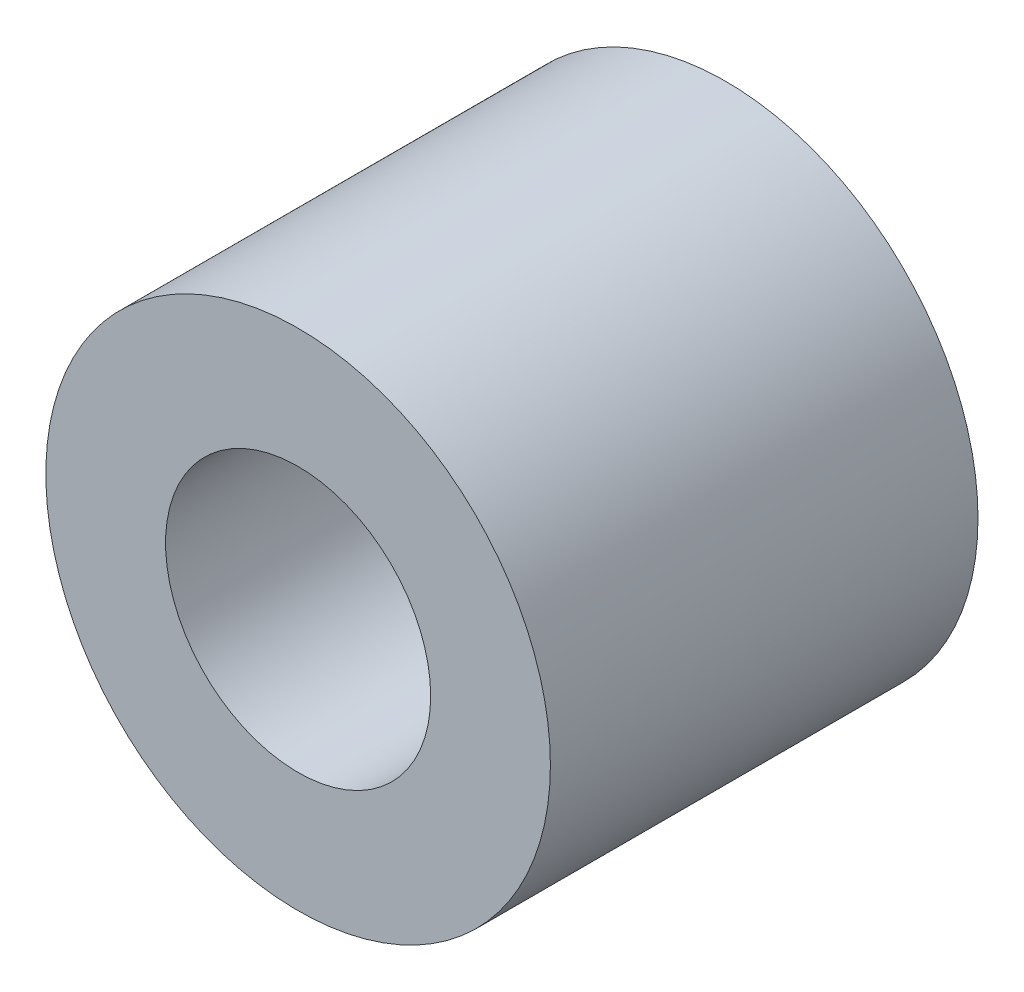
ISO-10303-21;
HEADER;
FILE_DESCRIPTION(('STEP AP214'),'2;1');
FILE_NAME('part.step','',(''),(''),'','','');
FILE_SCHEMA(('AUTOMOTIVE_DESIGN { 1 0 10303 214 1 1 1 1 }'));
ENDSEC;
DATA;
#1=APPLICATION_CONTEXT('core data for automotive mechanical design processes');
#2=APPLICATION_PROTOCOL_DEFINITION('international standard','automotive_design',2000,#1);
#3=PRODUCT_CONTEXT('',#1,'mechanical');
#4=PRODUCT('Part','Part','',(#3));
#5=PRODUCT_RELATED_PRODUCT_CATEGORY('part','',(#4));
#6=PRODUCT_DEFINITION_FORMATION('','',#4);
#7=PRODUCT_DEFINITION_CONTEXT('part definition',#1,'design');
#8=PRODUCT_DEFINITION('design','',#6,#7);
#9=PRODUCT_DEFINITION_SHAPE('','',#8);
#10=(LENGTH_UNIT() NAMED_UNIT(*) SI_UNIT(.MILLI.,.METRE.));
#11=(NAMED_UNIT(*) PLANE_ANGLE_UNIT() SI_UNIT($,.RADIAN.));
#12=(NAMED_UNIT(*) SI_UNIT($,.STERADIAN.) SOLID_ANGLE_UNIT());
#13=UNCERTAINTY_MEASURE_WITH_UNIT(LENGTH_MEASURE(1.E-05),#10,'distance_accuracy_value','');
#14=(GEOMETRIC_REPRESENTATION_CONTEXT(3) GLOBAL_UNCERTAINTY_ASSIGNED_CONTEXT((#13)) GLOBAL_UNIT_ASSIGNED_CONTEXT((#10,
#11,#12)) REPRESENTATION_CONTEXT('',''));
#15=CARTESIAN_POINT('',(0.,0.,0.));
#16=DIRECTION('',(0.,0.,1.));
#17=DIRECTION('',(1.,0.,0.));
#18=AXIS2_PLACEMENT_3D('',#15,#16,#17);
#19=CARTESIAN_POINT('',(0.,0.,5.));
#20=DIRECTION('',(0.,0.,-1.));
#21=DIRECTION('',(-1.,0.,0.));
#22=AXIS2_PLACEMENT_3D('',#19,#20,#21);
#23=CYLINDRICAL_SURFACE('',#22,2.95);
#24=CARTESIAN_POINT('',(0.,0.,5.));
#25=DIRECTION('',(0.,0.,1.));
#26=DIRECTION('',(1.,0.,0.));
#27=AXIS2_PLACEMENT_3D('',#24,#25,#26);
#28=CIRCLE('',#27,2.95);
#29=CARTESIAN_POINT('',(2.95,0.,5.));
#30=VERTEX_POINT('',#29);
#31=EDGE_CURVE('E10',#30,#30,#28,.T.);
#32=ORIENTED_EDGE('',*,*,#31,.F.);
#33=EDGE_LOOP('',(#32));
#34=FACE_BOUND('',#33,.T.);
#35=CARTESIAN_POINT('',(0.,0.,0.));
#36=DIRECTION('',(0.,0.,1.));
#37=DIRECTION('',(1.,0.,0.));
#38=AXIS2_PLACEMENT_3D('',#35,#36,#37);
#39=CIRCLE('',#38,2.95);
#40=CARTESIAN_POINT('',(2.95,0.,0.));
#41=VERTEX_POINT('',#40);
#42=EDGE_CURVE('E34',#41,#41,#39,.T.);
#43=ORIENTED_EDGE('',*,*,#42,.T.);
#44=EDGE_LOOP('',(#43));
#45=FACE_BOUND('',#44,.T.);
#46=ADVANCED_FACE('F31',(#34,#45),#23,.T.);
#47=CARTESIAN_POINT('',(0.,0.,5.));
#48=DIRECTION('',(0.,0.,1.));
#49=DIRECTION('',(1.,0.,0.));
#50=AXIS2_PLACEMENT_3D('',#47,#48,#49);
#51=PLANE('',#50);
#52=CARTESIAN_POINT('',(0.,0.,5.));
#53=DIRECTION('',(0.,0.,1.));
#54=DIRECTION('',(1.,0.,0.));
#55=AXIS2_PLACEMENT_3D('',#52,#53,#54);
#56=CIRCLE('',#55,1.55);
#57=CARTESIAN_POINT('',(1.55,0.,5.));
#58=VERTEX_POINT('',#57);
#59=EDGE_CURVE('E43',#58,#58,#56,.T.);
#60=ORIENTED_EDGE('',*,*,#59,.F.);
#61=EDGE_LOOP('',(#60));
#62=FACE_BOUND('',#61,.T.);
#63=ORIENTED_EDGE('',*,*,#31,.T.);
#64=EDGE_LOOP('',(#63));
#65=FACE_BOUND('',#64,.T.);
#66=ADVANCED_FACE('F58',(#62,#65),#51,.T.);
#67=CARTESIAN_POINT('',(0.,0.,0.));
#68=DIRECTION('',(0.,0.,1.));
#69=DIRECTION('',(1.,0.,0.));
#70=AXIS2_PLACEMENT_3D('',#67,#68,#69);
#71=PLANE('',#70);
#72=CARTESIAN_POINT('',(0.,0.,0.));
#73=DIRECTION('',(0.,0.,1.));
#74=DIRECTION('',(1.,0.,0.));
#75=AXIS2_PLACEMENT_3D('',#72,#73,#74);
#76=CIRCLE('',#75,1.55);
#77=CARTESIAN_POINT('',(1.55,0.,0.));
#78=VERTEX_POINT('',#77);
#79=EDGE_CURVE('E41',#78,#78,#76,.T.);
#80=ORIENTED_EDGE('',*,*,#79,.T.);
#81=EDGE_LOOP('',(#80));
#82=FACE_BOUND('',#81,.T.);
#83=ORIENTED_EDGE('',*,*,#42,.F.);
#84=EDGE_LOOP('',(#83));
#85=FACE_BOUND('',#84,.T.);
#86=ADVANCED_FACE('F49',(#82,#85),#71,.F.);
#87=CARTESIAN_POINT('',(0.,0.,0.));
#88=DIRECTION('',(0.,0.,1.));
#89=DIRECTION('',(1.,0.,0.));
#90=AXIS2_PLACEMENT_3D('',#87,#88,#89);
#91=CYLINDRICAL_SURFACE('',#90,1.55);
#92=ORIENTED_EDGE('',*,*,#79,.F.);
#93=EDGE_LOOP('',(#92));
#94=FACE_BOUND('',#93,.T.);
#95=ORIENTED_EDGE('',*,*,#59,.T.);
#96=EDGE_LOOP('',(#95));
#97=FACE_BOUND('',#96,.T.);
#98=ADVANCED_FACE('F52',(#94,#97),#91,.F.);
#99=CLOSED_SHELL('',(#46,#66,#86,#98));
#100=MANIFOLD_SOLID_BREP('B2',#99);
#101=ADVANCED_BREP_SHAPE_REPRESENTATION('',(#18,#100),#14);
#102=SHAPE_DEFINITION_REPRESENTATION(#9,#101);
ENDSEC;
END-ISO-10303-21;
